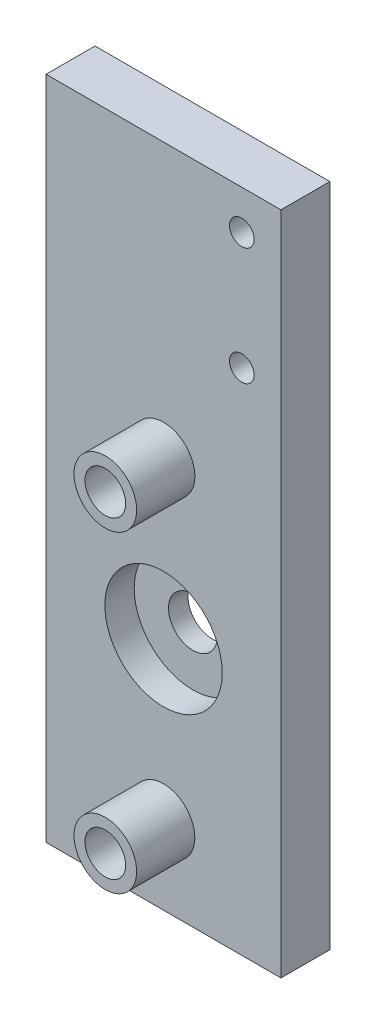
ISO-10303-21;
HEADER;
FILE_DESCRIPTION(('STEP AP214'),'2;1');
FILE_NAME('part.step','',(''),(''),'','','');
FILE_SCHEMA(('AUTOMOTIVE_DESIGN { 1 0 10303 214 1 1 1 1 }'));
ENDSEC;
DATA;
#1=APPLICATION_CONTEXT('core data for automotive mechanical design processes');
#2=APPLICATION_PROTOCOL_DEFINITION('international standard','automotive_design',2000,#1);
#3=PRODUCT_CONTEXT('',#1,'mechanical');
#4=PRODUCT('Part','Part','',(#3));
#5=PRODUCT_RELATED_PRODUCT_CATEGORY('part','',(#4));
#6=PRODUCT_DEFINITION_FORMATION('','',#4);
#7=PRODUCT_DEFINITION_CONTEXT('part definition',#1,'design');
#8=PRODUCT_DEFINITION('design','',#6,#7);
#9=PRODUCT_DEFINITION_SHAPE('','',#8);
#10=(LENGTH_UNIT() NAMED_UNIT(*) SI_UNIT(.MILLI.,.METRE.));
#11=(NAMED_UNIT(*) PLANE_ANGLE_UNIT() SI_UNIT($,.RADIAN.));
#12=(NAMED_UNIT(*) SI_UNIT($,.STERADIAN.) SOLID_ANGLE_UNIT());
#13=UNCERTAINTY_MEASURE_WITH_UNIT(LENGTH_MEASURE(1.E-05),#10,'distance_accuracy_value','');
#14=(GEOMETRIC_REPRESENTATION_CONTEXT(3) GLOBAL_UNCERTAINTY_ASSIGNED_CONTEXT((#13)) GLOBAL_UNIT_ASSIGNED_CONTEXT((#10,
#11,#12)) REPRESENTATION_CONTEXT('',''));
#15=CARTESIAN_POINT('',(0.,0.,0.));
#16=DIRECTION('',(0.,0.,1.));
#17=DIRECTION('',(1.,0.,0.));
#18=AXIS2_PLACEMENT_3D('',#15,#16,#17);
#19=CARTESIAN_POINT('',(19.05,-38.1,7.9375));
#20=DIRECTION('',(-1.,0.,0.));
#21=DIRECTION('',(0.,0.,1.));
#22=AXIS2_PLACEMENT_3D('',#19,#20,#21);
#23=PLANE('',#22);
#24=DIRECTION('',(0.,1.,0.));
#25=VECTOR('',#24,1.);
#26=CARTESIAN_POINT('',(19.05,-38.1,0.));
#27=LINE('',#26,#25);
#28=CARTESIAN_POINT('',(19.05,-38.1,0.));
#29=VERTEX_POINT('',#28);
#30=CARTESIAN_POINT('',(19.05,69.85,0.));
#31=VERTEX_POINT('',#30);
#32=EDGE_CURVE('E77',#29,#31,#27,.T.);
#33=ORIENTED_EDGE('',*,*,#32,.T.);
#34=DIRECTION('',(0.,0.,1.));
#35=VECTOR('',#34,1.);
#36=CARTESIAN_POINT('',(19.05,69.85,-49.5950854420072));
#37=LINE('',#36,#35);
#38=CARTESIAN_POINT('',(19.05,69.85,7.9375));
#39=VERTEX_POINT('',#38);
#40=EDGE_CURVE('E99',#31,#39,#37,.T.);
#41=ORIENTED_EDGE('',*,*,#40,.T.);
#42=DIRECTION('',(0.,1.,0.));
#43=VECTOR('',#42,1.);
#44=CARTESIAN_POINT('',(19.05,-38.1,7.9375));
#45=LINE('',#44,#43);
#46=CARTESIAN_POINT('',(19.05,-38.1,7.9375));
#47=VERTEX_POINT('',#46);
#48=EDGE_CURVE('E91',#47,#39,#45,.T.);
#49=ORIENTED_EDGE('',*,*,#48,.F.);
#50=DIRECTION('',(0.,0.,-1.));
#51=VECTOR('',#50,1.);
#52=CARTESIAN_POINT('',(19.05,-38.1,7.9375));
#53=LINE('',#52,#51);
#54=EDGE_CURVE('E154',#47,#29,#53,.T.);
#55=ORIENTED_EDGE('',*,*,#54,.T.);
#56=EDGE_LOOP('',(#33,#41,#49,#55));
#57=FACE_BOUND('',#56,.T.);
#58=ADVANCED_FACE('F41',(#57),#23,.F.);
#59=CARTESIAN_POINT('',(-19.05,-38.1,7.9375));
#60=DIRECTION('',(1.,0.,0.));
#61=DIRECTION('',(0.,0.,-1.));
#62=AXIS2_PLACEMENT_3D('',#59,#60,#61);
#63=PLANE('',#62);
#64=DIRECTION('',(0.,-1.,0.));
#65=VECTOR('',#64,1.);
#66=CARTESIAN_POINT('',(-19.05,-38.1,0.));
#67=LINE('',#66,#65);
#68=CARTESIAN_POINT('',(-19.05,69.85,0.));
#69=VERTEX_POINT('',#68);
#70=CARTESIAN_POINT('',(-19.05,-38.1,0.));
#71=VERTEX_POINT('',#70);
#72=EDGE_CURVE('E68',#69,#71,#67,.T.);
#73=ORIENTED_EDGE('',*,*,#72,.T.);
#74=DIRECTION('',(0.,0.,-1.));
#75=VECTOR('',#74,1.);
#76=CARTESIAN_POINT('',(-19.05,-38.1,7.9375));
#77=LINE('',#76,#75);
#78=CARTESIAN_POINT('',(-19.05,-38.1,7.9375));
#79=VERTEX_POINT('',#78);
#80=EDGE_CURVE('E49',#79,#71,#77,.T.);
#81=ORIENTED_EDGE('',*,*,#80,.F.);
#82=DIRECTION('',(0.,-1.,0.));
#83=VECTOR('',#82,1.);
#84=CARTESIAN_POINT('',(-19.05,-38.1,7.9375));
#85=LINE('',#84,#83);
#86=CARTESIAN_POINT('',(-19.05,69.85,7.9375));
#87=VERTEX_POINT('',#86);
#88=EDGE_CURVE('E85',#87,#79,#85,.T.);
#89=ORIENTED_EDGE('',*,*,#88,.F.);
#90=DIRECTION('',(0.,0.,1.));
#91=VECTOR('',#90,1.);
#92=CARTESIAN_POINT('',(-19.05,69.85,-49.5950854420072));
#93=LINE('',#92,#91);
#94=EDGE_CURVE('E88',#69,#87,#93,.T.);
#95=ORIENTED_EDGE('',*,*,#94,.F.);
#96=EDGE_LOOP('',(#73,#81,#89,#95));
#97=FACE_BOUND('',#96,.T.);
#98=ADVANCED_FACE('F87',(#97),#63,.F.);
#99=CARTESIAN_POINT('',(-19.05,-38.1,7.9375));
#100=DIRECTION('',(0.,1.,0.));
#101=DIRECTION('',(0.,0.,1.));
#102=AXIS2_PLACEMENT_3D('',#99,#100,#101);
#103=PLANE('',#102);
#104=DIRECTION('',(1.,0.,0.));
#105=VECTOR('',#104,1.);
#106=CARTESIAN_POINT('',(-19.05,-38.1,0.));
#107=LINE('',#106,#105);
#108=EDGE_CURVE('E151',#71,#29,#107,.T.);
#109=ORIENTED_EDGE('',*,*,#108,.T.);
#110=ORIENTED_EDGE('',*,*,#54,.F.);
#111=DIRECTION('',(1.,0.,0.));
#112=VECTOR('',#111,1.);
#113=CARTESIAN_POINT('',(-19.05,-38.1,7.9375));
#114=LINE('',#113,#112);
#115=EDGE_CURVE('E57',#79,#47,#114,.T.);
#116=ORIENTED_EDGE('',*,*,#115,.F.);
#117=ORIENTED_EDGE('',*,*,#80,.T.);
#118=EDGE_LOOP('',(#109,#110,#116,#117));
#119=FACE_BOUND('',#118,.T.);
#120=ADVANCED_FACE('F184',(#119),#103,.F.);
#121=CARTESIAN_POINT('',(0.,0.,7.9375));
#122=DIRECTION('',(0.,0.,-1.));
#123=DIRECTION('',(-1.,0.,0.));
#124=AXIS2_PLACEMENT_3D('',#121,#122,#123);
#125=PLANE('',#124);
#126=CARTESIAN_POINT('',(0.,-25.4,7.9375));
#127=DIRECTION('',(0.,0.,-1.));
#128=DIRECTION('',(1.,0.,0.));
#129=AXIS2_PLACEMENT_3D('',#126,#127,#128);
#130=CIRCLE('',#129,5.08);
#131=CARTESIAN_POINT('',(5.08,-25.4,7.9375));
#132=VERTEX_POINT('',#131);
#133=EDGE_CURVE('E124',#132,#132,#130,.T.);
#134=ORIENTED_EDGE('',*,*,#133,.T.);
#135=EDGE_LOOP('',(#134));
#136=FACE_BOUND('',#135,.T.);
#137=CARTESIAN_POINT('',(0.,25.4,7.9375));
#138=DIRECTION('',(0.,0.,-1.));
#139=DIRECTION('',(-1.,0.,0.));
#140=AXIS2_PLACEMENT_3D('',#137,#138,#139);
#141=CIRCLE('',#140,5.08);
#142=CARTESIAN_POINT('',(-5.08,25.4,7.9375));
#143=VERTEX_POINT('',#142);
#144=EDGE_CURVE('E12',#143,#143,#141,.F.);
#145=ORIENTED_EDGE('',*,*,#144,.F.);
#146=EDGE_LOOP('',(#145));
#147=FACE_BOUND('',#146,.T.);
#148=CARTESIAN_POINT('',(0.,0.,7.9375));
#149=DIRECTION('',(0.,0.,1.));
#150=DIRECTION('',(1.,0.,0.));
#151=AXIS2_PLACEMENT_3D('',#148,#149,#150);
#152=CIRCLE('',#151,9.525);
#153=CARTESIAN_POINT('',(9.525,0.,7.9375));
#154=VERTEX_POINT('',#153);
#155=EDGE_CURVE('E141',#154,#154,#152,.T.);
#156=ORIENTED_EDGE('',*,*,#155,.F.);
#157=EDGE_LOOP('',(#156));
#158=FACE_BOUND('',#157,.T.);
#159=ORIENTED_EDGE('',*,*,#48,.T.);
#160=DIRECTION('',(-1.,0.,0.));
#161=VECTOR('',#160,1.);
#162=CARTESIAN_POINT('',(-19.05,69.85,7.9375));
#163=LINE('',#162,#161);
#164=EDGE_CURVE('E97',#39,#87,#163,.T.);
#165=ORIENTED_EDGE('',*,*,#164,.T.);
#166=ORIENTED_EDGE('',*,*,#88,.T.);
#167=ORIENTED_EDGE('',*,*,#115,.T.);
#168=EDGE_LOOP('',(#159,#165,#166,#167));
#169=FACE_BOUND('',#168,.T.);
#170=CARTESIAN_POINT('',(12.7,44.45,7.9375));
#171=DIRECTION('',(0.,0.,1.));
#172=DIRECTION('',(-1.,0.,0.));
#173=AXIS2_PLACEMENT_3D('',#170,#171,#172);
#174=CIRCLE('',#173,2.);
#175=CARTESIAN_POINT('',(10.7,44.45,7.9375));
#176=VERTEX_POINT('',#175);
#177=EDGE_CURVE('E105',#176,#176,#174,.T.);
#178=ORIENTED_EDGE('',*,*,#177,.F.);
#179=EDGE_LOOP('',(#178));
#180=FACE_BOUND('',#179,.T.);
#181=CARTESIAN_POINT('',(12.7,63.5,7.9375));
#182=DIRECTION('',(0.,0.,1.));
#183=DIRECTION('',(1.,0.,0.));
#184=AXIS2_PLACEMENT_3D('',#181,#182,#183);
#185=CIRCLE('',#184,2.);
#186=CARTESIAN_POINT('',(14.7,63.5,7.9375));
#187=VERTEX_POINT('',#186);
#188=EDGE_CURVE('E111',#187,#187,#185,.T.);
#189=ORIENTED_EDGE('',*,*,#188,.F.);
#190=EDGE_LOOP('',(#189));
#191=FACE_BOUND('',#190,.T.);
#192=ADVANCED_FACE('F101',(#136,#147,#158,#169,#180,#191),#125,.F.);
#193=CARTESIAN_POINT('',(0.,0.,0.));
#194=DIRECTION('',(0.,0.,-1.));
#195=DIRECTION('',(-1.,0.,0.));
#196=AXIS2_PLACEMENT_3D('',#193,#194,#195);
#197=PLANE('',#196);
#198=CARTESIAN_POINT('',(0.,-25.4,0.));
#199=DIRECTION('',(0.,0.,-1.));
#200=DIRECTION('',(1.,0.,0.));
#201=AXIS2_PLACEMENT_3D('',#198,#199,#200);
#202=CIRCLE('',#201,3.302);
#203=CARTESIAN_POINT('',(3.302,-25.4,0.));
#204=VERTEX_POINT('',#203);
#205=EDGE_CURVE('E121',#204,#204,#202,.T.);
#206=ORIENTED_EDGE('',*,*,#205,.F.);
#207=EDGE_LOOP('',(#206));
#208=FACE_BOUND('',#207,.T.);
#209=CARTESIAN_POINT('',(0.,25.4,0.));
#210=DIRECTION('',(0.,0.,1.));
#211=DIRECTION('',(1.,0.,0.));
#212=AXIS2_PLACEMENT_3D('',#209,#210,#211);
#213=CIRCLE('',#212,3.302);
#214=CARTESIAN_POINT('',(3.302,25.4,0.));
#215=VERTEX_POINT('',#214);
#216=EDGE_CURVE('E133',#215,#215,#213,.T.);
#217=ORIENTED_EDGE('',*,*,#216,.T.);
#218=EDGE_LOOP('',(#217));
#219=FACE_BOUND('',#218,.T.);
#220=CARTESIAN_POINT('',(0.,0.,0.));
#221=DIRECTION('',(0.,0.,1.));
#222=DIRECTION('',(1.,0.,0.));
#223=AXIS2_PLACEMENT_3D('',#220,#221,#222);
#224=CIRCLE('',#223,3.96875);
#225=CARTESIAN_POINT('',(3.96875,0.,0.));
#226=VERTEX_POINT('',#225);
#227=EDGE_CURVE('E148',#226,#226,#224,.T.);
#228=ORIENTED_EDGE('',*,*,#227,.T.);
#229=EDGE_LOOP('',(#228));
#230=FACE_BOUND('',#229,.T.);
#231=ORIENTED_EDGE('',*,*,#32,.F.);
#232=ORIENTED_EDGE('',*,*,#108,.F.);
#233=ORIENTED_EDGE('',*,*,#72,.F.);
#234=DIRECTION('',(-1.,0.,0.));
#235=VECTOR('',#234,1.);
#236=CARTESIAN_POINT('',(-19.05,69.85,0.));
#237=LINE('',#236,#235);
#238=EDGE_CURVE('E98',#31,#69,#237,.T.);
#239=ORIENTED_EDGE('',*,*,#238,.F.);
#240=EDGE_LOOP('',(#231,#232,#233,#239));
#241=FACE_BOUND('',#240,.T.);
#242=CARTESIAN_POINT('',(12.7,44.45,0.));
#243=DIRECTION('',(0.,0.,-1.));
#244=DIRECTION('',(-1.,0.,0.));
#245=AXIS2_PLACEMENT_3D('',#242,#243,#244);
#246=CIRCLE('',#245,2.);
#247=CARTESIAN_POINT('',(10.7,44.45,0.));
#248=VERTEX_POINT('',#247);
#249=EDGE_CURVE('E104',#248,#248,#246,.F.);
#250=ORIENTED_EDGE('',*,*,#249,.T.);
#251=EDGE_LOOP('',(#250));
#252=FACE_BOUND('',#251,.T.);
#253=CARTESIAN_POINT('',(12.7,63.5,0.));
#254=DIRECTION('',(0.,0.,-1.));
#255=DIRECTION('',(-1.,0.,0.));
#256=AXIS2_PLACEMENT_3D('',#253,#254,#255);
#257=CIRCLE('',#256,2.);
#258=CARTESIAN_POINT('',(10.7,63.5,0.));
#259=VERTEX_POINT('',#258);
#260=EDGE_CURVE('E108',#259,#259,#257,.F.);
#261=ORIENTED_EDGE('',*,*,#260,.T.);
#262=EDGE_LOOP('',(#261));
#263=FACE_BOUND('',#262,.T.);
#264=ADVANCED_FACE('F177',(#208,#219,#230,#241,#252,#263),#197,.T.);
#265=CARTESIAN_POINT('',(0.,0.,0.));
#266=DIRECTION('',(0.,0.,1.));
#267=DIRECTION('',(1.,0.,0.));
#268=AXIS2_PLACEMENT_3D('',#265,#266,#267);
#269=CYLINDRICAL_SURFACE('',#268,3.96875);
#270=CARTESIAN_POINT('',(0.,0.,3.175));
#271=DIRECTION('',(0.,0.,-1.));
#272=DIRECTION('',(-1.,0.,0.));
#273=AXIS2_PLACEMENT_3D('',#270,#271,#272);
#274=CIRCLE('',#273,3.96875);
#275=CARTESIAN_POINT('',(-3.96875,0.,3.175));
#276=VERTEX_POINT('',#275);
#277=EDGE_CURVE('E147',#276,#276,#274,.F.);
#278=ORIENTED_EDGE('',*,*,#277,.T.);
#279=EDGE_LOOP('',(#278));
#280=FACE_BOUND('',#279,.T.);
#281=ORIENTED_EDGE('',*,*,#227,.F.);
#282=EDGE_LOOP('',(#281));
#283=FACE_BOUND('',#282,.T.);
#284=ADVANCED_FACE('F162',(#280,#283),#269,.F.);
#285=CARTESIAN_POINT('',(0.,0.,3.175));
#286=DIRECTION('',(0.,0.,-1.));
#287=DIRECTION('',(-1.,0.,0.));
#288=AXIS2_PLACEMENT_3D('',#285,#286,#287);
#289=PLANE('',#288);
#290=CARTESIAN_POINT('',(0.,0.,3.175));
#291=DIRECTION('',(0.,0.,-1.));
#292=DIRECTION('',(-1.,0.,0.));
#293=AXIS2_PLACEMENT_3D('',#290,#291,#292);
#294=CIRCLE('',#293,9.525);
#295=CARTESIAN_POINT('',(-9.525,0.,3.175));
#296=VERTEX_POINT('',#295);
#297=EDGE_CURVE('E144',#296,#296,#294,.F.);
#298=ORIENTED_EDGE('',*,*,#297,.T.);
#299=EDGE_LOOP('',(#298));
#300=FACE_BOUND('',#299,.T.);
#301=ORIENTED_EDGE('',*,*,#277,.F.);
#302=EDGE_LOOP('',(#301));
#303=FACE_BOUND('',#302,.T.);
#304=ADVANCED_FACE('F165',(#300,#303),#289,.F.);
#305=CARTESIAN_POINT('',(0.,0.,-26.9407683632075));
#306=DIRECTION('',(0.,0.,1.));
#307=DIRECTION('',(1.,0.,0.));
#308=AXIS2_PLACEMENT_3D('',#305,#306,#307);
#309=CYLINDRICAL_SURFACE('',#308,9.525);
#310=ORIENTED_EDGE('',*,*,#155,.T.);
#311=EDGE_LOOP('',(#310));
#312=FACE_BOUND('',#311,.T.);
#313=ORIENTED_EDGE('',*,*,#297,.F.);
#314=EDGE_LOOP('',(#313));
#315=FACE_BOUND('',#314,.T.);
#316=ADVANCED_FACE('F167',(#312,#315),#309,.F.);
#317=CARTESIAN_POINT('',(0.,25.4,17.3863));
#318=DIRECTION('',(0.,0.,-1.));
#319=DIRECTION('',(-1.,0.,0.));
#320=AXIS2_PLACEMENT_3D('',#317,#318,#319);
#321=CYLINDRICAL_SURFACE('',#320,5.08);
#322=CARTESIAN_POINT('',(0.,25.4,17.3863));
#323=DIRECTION('',(0.,0.,1.));
#324=DIRECTION('',(1.,0.,0.));
#325=AXIS2_PLACEMENT_3D('',#322,#323,#324);
#326=CIRCLE('',#325,5.08);
#327=CARTESIAN_POINT('',(5.08,25.4,17.3863));
#328=VERTEX_POINT('',#327);
#329=EDGE_CURVE('E136',#328,#328,#326,.T.);
#330=ORIENTED_EDGE('',*,*,#329,.F.);
#331=EDGE_LOOP('',(#330));
#332=FACE_BOUND('',#331,.T.);
#333=ORIENTED_EDGE('',*,*,#144,.T.);
#334=EDGE_LOOP('',(#333));
#335=FACE_BOUND('',#334,.T.);
#336=ADVANCED_FACE('F174',(#332,#335),#321,.T.);
#337=CARTESIAN_POINT('',(0.,25.4,17.3863));
#338=DIRECTION('',(0.,0.,1.));
#339=DIRECTION('',(1.,0.,0.));
#340=AXIS2_PLACEMENT_3D('',#337,#338,#339);
#341=PLANE('',#340);
#342=CARTESIAN_POINT('',(0.,25.4,17.3863));
#343=DIRECTION('',(0.,0.,1.));
#344=DIRECTION('',(1.,0.,0.));
#345=AXIS2_PLACEMENT_3D('',#342,#343,#344);
#346=CIRCLE('',#345,3.302);
#347=CARTESIAN_POINT('',(3.302,25.4,17.3863));
#348=VERTEX_POINT('',#347);
#349=EDGE_CURVE('E130',#348,#348,#346,.T.);
#350=ORIENTED_EDGE('',*,*,#349,.F.);
#351=EDGE_LOOP('',(#350));
#352=FACE_BOUND('',#351,.T.);
#353=ORIENTED_EDGE('',*,*,#329,.T.);
#354=EDGE_LOOP('',(#353));
#355=FACE_BOUND('',#354,.T.);
#356=ADVANCED_FACE('F207',(#352,#355),#341,.T.);
#357=CARTESIAN_POINT('',(0.,25.4,0.));
#358=DIRECTION('',(0.,0.,1.));
#359=DIRECTION('',(1.,0.,0.));
#360=AXIS2_PLACEMENT_3D('',#357,#358,#359);
#361=CYLINDRICAL_SURFACE('',#360,3.302);
#362=ORIENTED_EDGE('',*,*,#216,.F.);
#363=EDGE_LOOP('',(#362));
#364=FACE_BOUND('',#363,.T.);
#365=ORIENTED_EDGE('',*,*,#349,.T.);
#366=EDGE_LOOP('',(#365));
#367=FACE_BOUND('',#366,.T.);
#368=ADVANCED_FACE('F213',(#364,#367),#361,.F.);
#369=CARTESIAN_POINT('',(0.,-25.4,17.3863));
#370=DIRECTION('',(0.,0.,-1.));
#371=DIRECTION('',(-1.,0.,0.));
#372=AXIS2_PLACEMENT_3D('',#369,#370,#371);
#373=CYLINDRICAL_SURFACE('',#372,5.08);
#374=CARTESIAN_POINT('',(0.,-25.4,17.3863));
#375=DIRECTION('',(0.,0.,-1.));
#376=DIRECTION('',(1.,0.,0.));
#377=AXIS2_PLACEMENT_3D('',#374,#375,#376);
#378=CIRCLE('',#377,5.08);
#379=CARTESIAN_POINT('',(5.08,-25.4,17.3863));
#380=VERTEX_POINT('',#379);
#381=EDGE_CURVE('E127',#380,#380,#378,.T.);
#382=ORIENTED_EDGE('',*,*,#381,.T.);
#383=EDGE_LOOP('',(#382));
#384=FACE_BOUND('',#383,.T.);
#385=ORIENTED_EDGE('',*,*,#133,.F.);
#386=EDGE_LOOP('',(#385));
#387=FACE_BOUND('',#386,.T.);
#388=ADVANCED_FACE('F220',(#384,#387),#373,.T.);
#389=CARTESIAN_POINT('',(0.,-25.4,17.3863));
#390=DIRECTION('',(0.,0.,1.));
#391=DIRECTION('',(1.,0.,0.));
#392=AXIS2_PLACEMENT_3D('',#389,#390,#391);
#393=PLANE('',#392);
#394=CARTESIAN_POINT('',(0.,-25.4,17.3863));
#395=DIRECTION('',(0.,0.,-1.));
#396=DIRECTION('',(1.,0.,0.));
#397=AXIS2_PLACEMENT_3D('',#394,#395,#396);
#398=CIRCLE('',#397,3.302);
#399=CARTESIAN_POINT('',(3.302,-25.4,17.3863));
#400=VERTEX_POINT('',#399);
#401=EDGE_CURVE('E117',#400,#400,#398,.T.);
#402=ORIENTED_EDGE('',*,*,#401,.T.);
#403=EDGE_LOOP('',(#402));
#404=FACE_BOUND('',#403,.T.);
#405=ORIENTED_EDGE('',*,*,#381,.F.);
#406=EDGE_LOOP('',(#405));
#407=FACE_BOUND('',#406,.T.);
#408=ADVANCED_FACE('F224',(#404,#407),#393,.T.);
#409=CARTESIAN_POINT('',(0.,-25.4,0.));
#410=DIRECTION('',(0.,0.,1.));
#411=DIRECTION('',(1.,0.,0.));
#412=AXIS2_PLACEMENT_3D('',#409,#410,#411);
#413=CYLINDRICAL_SURFACE('',#412,3.302);
#414=ORIENTED_EDGE('',*,*,#205,.T.);
#415=EDGE_LOOP('',(#414));
#416=FACE_BOUND('',#415,.T.);
#417=ORIENTED_EDGE('',*,*,#401,.F.);
#418=EDGE_LOOP('',(#417));
#419=FACE_BOUND('',#418,.T.);
#420=ADVANCED_FACE('F228',(#416,#419),#413,.F.);
#421=CARTESIAN_POINT('',(-19.05,69.85,-49.5950854420072));
#422=DIRECTION('',(0.,1.,0.));
#423=DIRECTION('',(0.,0.,1.));
#424=AXIS2_PLACEMENT_3D('',#421,#422,#423);
#425=PLANE('',#424);
#426=ORIENTED_EDGE('',*,*,#40,.F.);
#427=ORIENTED_EDGE('',*,*,#238,.T.);
#428=ORIENTED_EDGE('',*,*,#94,.T.);
#429=ORIENTED_EDGE('',*,*,#164,.F.);
#430=EDGE_LOOP('',(#426,#427,#428,#429));
#431=FACE_BOUND('',#430,.T.);
#432=ADVANCED_FACE('F96',(#431),#425,.T.);
#433=CARTESIAN_POINT('',(12.7,63.5,-49.5950854420072));
#434=DIRECTION('',(0.,0.,1.));
#435=DIRECTION('',(1.,0.,0.));
#436=AXIS2_PLACEMENT_3D('',#433,#434,#435);
#437=CYLINDRICAL_SURFACE('',#436,2.);
#438=ORIENTED_EDGE('',*,*,#188,.T.);
#439=EDGE_LOOP('',(#438));
#440=FACE_BOUND('',#439,.T.);
#441=ORIENTED_EDGE('',*,*,#260,.F.);
#442=EDGE_LOOP('',(#441));
#443=FACE_BOUND('',#442,.T.);
#444=ADVANCED_FACE('F235',(#440,#443),#437,.F.);
#445=CARTESIAN_POINT('',(12.7,44.45,-49.5950854420072));
#446=DIRECTION('',(0.,0.,1.));
#447=DIRECTION('',(1.,0.,0.));
#448=AXIS2_PLACEMENT_3D('',#445,#446,#447);
#449=CYLINDRICAL_SURFACE('',#448,2.);
#450=ORIENTED_EDGE('',*,*,#177,.T.);
#451=EDGE_LOOP('',(#450));
#452=FACE_BOUND('',#451,.T.);
#453=ORIENTED_EDGE('',*,*,#249,.F.);
#454=EDGE_LOOP('',(#453));
#455=FACE_BOUND('',#454,.T.);
#456=ADVANCED_FACE('F232',(#452,#455),#449,.F.);
#457=CLOSED_SHELL('',(#58,#98,#120,#192,#264,#284,#304,#316,#336,#356,#368,#388,#408,#420,#432,
#444,#456));
#458=MANIFOLD_SOLID_BREP('B2',#457);
#459=ADVANCED_BREP_SHAPE_REPRESENTATION('',(#18,#458),#14);
#460=SHAPE_DEFINITION_REPRESENTATION(#9,#459);
ENDSEC;
END-ISO-10303-21;
